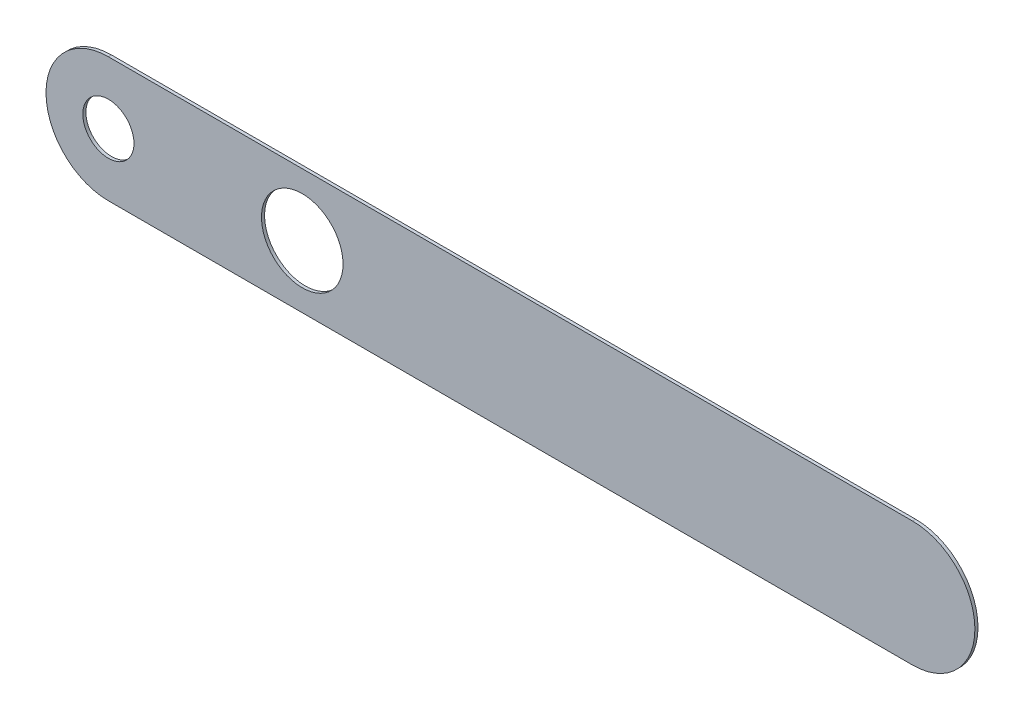
ISO-10303-21;
HEADER;
FILE_DESCRIPTION(('STEP AP214'),'2;1');
FILE_NAME('part.step','',(''),(''),'','','');
FILE_SCHEMA(('AUTOMOTIVE_DESIGN { 1 0 10303 214 1 1 1 1 }'));
ENDSEC;
DATA;
#1=APPLICATION_CONTEXT('core data for automotive mechanical design processes');
#2=APPLICATION_PROTOCOL_DEFINITION('international standard','automotive_design',2000,#1);
#3=PRODUCT_CONTEXT('',#1,'mechanical');
#4=PRODUCT('Part','Part','',(#3));
#5=PRODUCT_RELATED_PRODUCT_CATEGORY('part','',(#4));
#6=PRODUCT_DEFINITION_FORMATION('','',#4);
#7=PRODUCT_DEFINITION_CONTEXT('part definition',#1,'design');
#8=PRODUCT_DEFINITION('design','',#6,#7);
#9=PRODUCT_DEFINITION_SHAPE('','',#8);
#10=(LENGTH_UNIT() NAMED_UNIT(*) SI_UNIT(.MILLI.,.METRE.));
#11=(NAMED_UNIT(*) PLANE_ANGLE_UNIT() SI_UNIT($,.RADIAN.));
#12=(NAMED_UNIT(*) SI_UNIT($,.STERADIAN.) SOLID_ANGLE_UNIT());
#13=UNCERTAINTY_MEASURE_WITH_UNIT(LENGTH_MEASURE(1.E-05),#10,'distance_accuracy_value','');
#14=(GEOMETRIC_REPRESENTATION_CONTEXT(3) GLOBAL_UNCERTAINTY_ASSIGNED_CONTEXT((#13)) GLOBAL_UNIT_ASSIGNED_CONTEXT((#10,
#11,#12)) REPRESENTATION_CONTEXT('',''));
#15=CARTESIAN_POINT('',(0.,0.,0.));
#16=DIRECTION('',(0.,0.,1.));
#17=DIRECTION('',(1.,0.,0.));
#18=AXIS2_PLACEMENT_3D('',#15,#16,#17);
#19=CARTESIAN_POINT('',(-120.913379039705,0.,-0.7366));
#20=DIRECTION('',(0.,0.,1.));
#21=DIRECTION('',(1.,0.,0.));
#22=AXIS2_PLACEMENT_3D('',#19,#20,#21);
#23=CYLINDRICAL_SURFACE('',#22,14.7879672206833);
#24=CARTESIAN_POINT('',(-120.913379039705,0.,0.));
#25=DIRECTION('',(0.,0.,1.));
#26=DIRECTION('',(1.,0.,0.));
#27=AXIS2_PLACEMENT_3D('',#24,#25,#26);
#28=CIRCLE('',#27,14.7879672206833);
#29=CARTESIAN_POINT('',(-120.913379039705,14.7879672206833,0.));
#30=VERTEX_POINT('',#29);
#31=CARTESIAN_POINT('',(-120.913379039705,-14.7879672206833,0.));
#32=VERTEX_POINT('',#31);
#33=EDGE_CURVE('E100',#30,#32,#28,.T.);
#34=ORIENTED_EDGE('',*,*,#33,.F.);
#35=DIRECTION('',(0.,0.,1.));
#36=VECTOR('',#35,1.);
#37=CARTESIAN_POINT('',(-120.913379039705,14.7879672206833,-0.7366));
#38=LINE('',#37,#36);
#39=CARTESIAN_POINT('',(-120.913379039705,14.7879672206833,-0.7366));
#40=VERTEX_POINT('',#39);
#41=EDGE_CURVE('E11',#40,#30,#38,.T.);
#42=ORIENTED_EDGE('',*,*,#41,.F.);
#43=CARTESIAN_POINT('',(-120.913379039705,0.,-0.7366));
#44=DIRECTION('',(0.,0.,1.));
#45=DIRECTION('',(1.,0.,0.));
#46=AXIS2_PLACEMENT_3D('',#43,#44,#45);
#47=CIRCLE('',#46,14.7879672206833);
#48=CARTESIAN_POINT('',(-120.913379039705,-14.7879672206833,-0.7366));
#49=VERTEX_POINT('',#48);
#50=EDGE_CURVE('E93',#40,#49,#47,.T.);
#51=ORIENTED_EDGE('',*,*,#50,.T.);
#52=DIRECTION('',(0.,0.,1.));
#53=VECTOR('',#52,1.);
#54=CARTESIAN_POINT('',(-120.913379039705,-14.7879672206833,-0.7366));
#55=LINE('',#54,#53);
#56=EDGE_CURVE('E38',#49,#32,#55,.T.);
#57=ORIENTED_EDGE('',*,*,#56,.T.);
#58=EDGE_LOOP('',(#34,#42,#51,#57));
#59=FACE_BOUND('',#58,.T.);
#60=ADVANCED_FACE('F35',(#59),#23,.T.);
#61=CARTESIAN_POINT('',(-120.913379039705,14.7879672206833,-0.7366));
#62=DIRECTION('',(0.,1.,0.));
#63=DIRECTION('',(0.,0.,1.));
#64=AXIS2_PLACEMENT_3D('',#61,#62,#63);
#65=PLANE('',#64);
#66=DIRECTION('',(-1.,0.,0.));
#67=VECTOR('',#66,1.);
#68=CARTESIAN_POINT('',(-120.913379039705,14.7879672206833,0.));
#69=LINE('',#68,#67);
#70=CARTESIAN_POINT('',(69.7147026117926,14.7879672206833,0.));
#71=VERTEX_POINT('',#70);
#72=EDGE_CURVE('E95',#71,#30,#69,.T.);
#73=ORIENTED_EDGE('',*,*,#72,.F.);
#74=DIRECTION('',(0.,0.,1.));
#75=VECTOR('',#74,1.);
#76=CARTESIAN_POINT('',(69.7147026117926,14.7879672206833,-0.7366));
#77=LINE('',#76,#75);
#78=CARTESIAN_POINT('',(69.7147026117926,14.7879672206833,-0.7366));
#79=VERTEX_POINT('',#78);
#80=EDGE_CURVE('E44',#79,#71,#77,.T.);
#81=ORIENTED_EDGE('',*,*,#80,.F.);
#82=DIRECTION('',(-1.,0.,0.));
#83=VECTOR('',#82,1.);
#84=CARTESIAN_POINT('',(-120.913379039705,14.7879672206833,-0.7366));
#85=LINE('',#84,#83);
#86=EDGE_CURVE('E90',#79,#40,#85,.T.);
#87=ORIENTED_EDGE('',*,*,#86,.T.);
#88=ORIENTED_EDGE('',*,*,#41,.T.);
#89=EDGE_LOOP('',(#73,#81,#87,#88));
#90=FACE_BOUND('',#89,.T.);
#91=ADVANCED_FACE('F111',(#90),#65,.T.);
#92=CARTESIAN_POINT('',(69.7147026117926,0.,-0.7366));
#93=DIRECTION('',(0.,0.,1.));
#94=DIRECTION('',(1.,0.,0.));
#95=AXIS2_PLACEMENT_3D('',#92,#93,#94);
#96=CYLINDRICAL_SURFACE('',#95,14.7879672206833);
#97=CARTESIAN_POINT('',(69.7147026117926,0.,0.));
#98=DIRECTION('',(0.,0.,1.));
#99=DIRECTION('',(1.,0.,0.));
#100=AXIS2_PLACEMENT_3D('',#97,#98,#99);
#101=CIRCLE('',#100,14.7879672206833);
#102=CARTESIAN_POINT('',(69.7147026117926,-14.7879672206833,0.));
#103=VERTEX_POINT('',#102);
#104=EDGE_CURVE('E85',#103,#71,#101,.T.);
#105=ORIENTED_EDGE('',*,*,#104,.F.);
#106=DIRECTION('',(0.,0.,1.));
#107=VECTOR('',#106,1.);
#108=CARTESIAN_POINT('',(69.7147026117926,-14.7879672206833,-0.7366));
#109=LINE('',#108,#107);
#110=CARTESIAN_POINT('',(69.7147026117926,-14.7879672206833,-0.7366));
#111=VERTEX_POINT('',#110);
#112=EDGE_CURVE('E80',#111,#103,#109,.T.);
#113=ORIENTED_EDGE('',*,*,#112,.F.);
#114=CARTESIAN_POINT('',(69.7147026117926,0.,-0.7366));
#115=DIRECTION('',(0.,0.,1.));
#116=DIRECTION('',(1.,0.,0.));
#117=AXIS2_PLACEMENT_3D('',#114,#115,#116);
#118=CIRCLE('',#117,14.7879672206833);
#119=EDGE_CURVE('E83',#111,#79,#118,.T.);
#120=ORIENTED_EDGE('',*,*,#119,.T.);
#121=ORIENTED_EDGE('',*,*,#80,.T.);
#122=EDGE_LOOP('',(#105,#113,#120,#121));
#123=FACE_BOUND('',#122,.T.);
#124=ADVANCED_FACE('F82',(#123),#96,.T.);
#125=CARTESIAN_POINT('',(-120.913379039705,-14.7879672206833,-0.7366));
#126=DIRECTION('',(0.,-1.,0.));
#127=DIRECTION('',(0.,0.,-1.));
#128=AXIS2_PLACEMENT_3D('',#125,#126,#127);
#129=PLANE('',#128);
#130=DIRECTION('',(1.,0.,0.));
#131=VECTOR('',#130,1.);
#132=CARTESIAN_POINT('',(-120.913379039705,-14.7879672206833,0.));
#133=LINE('',#132,#131);
#134=EDGE_CURVE('E103',#32,#103,#133,.T.);
#135=ORIENTED_EDGE('',*,*,#134,.F.);
#136=ORIENTED_EDGE('',*,*,#56,.F.);
#137=DIRECTION('',(1.,0.,0.));
#138=VECTOR('',#137,1.);
#139=CARTESIAN_POINT('',(-120.913379039705,-14.7879672206833,-0.7366));
#140=LINE('',#139,#138);
#141=EDGE_CURVE('E89',#49,#111,#140,.T.);
#142=ORIENTED_EDGE('',*,*,#141,.T.);
#143=ORIENTED_EDGE('',*,*,#112,.T.);
#144=EDGE_LOOP('',(#135,#136,#142,#143));
#145=FACE_BOUND('',#144,.T.);
#146=ADVANCED_FACE('F92',(#145),#129,.T.);
#147=CARTESIAN_POINT('',(-120.913379039705,0.,-0.7366));
#148=DIRECTION('',(0.,0.,1.));
#149=DIRECTION('',(1.,0.,0.));
#150=AXIS2_PLACEMENT_3D('',#147,#148,#149);
#151=PLANE('',#150);
#152=CARTESIAN_POINT('',(-120.913379039705,0.,-0.7366));
#153=DIRECTION('',(0.,0.,1.));
#154=DIRECTION('',(1.,0.,0.));
#155=AXIS2_PLACEMENT_3D('',#152,#153,#154);
#156=CIRCLE('',#155,6.06374899348178);
#157=CARTESIAN_POINT('',(-114.849630046223,0.,-0.7366));
#158=VERTEX_POINT('',#157);
#159=EDGE_CURVE('E144',#158,#158,#156,.T.);
#160=ORIENTED_EDGE('',*,*,#159,.T.);
#161=EDGE_LOOP('',(#160));
#162=FACE_BOUND('',#161,.T.);
#163=CARTESIAN_POINT('',(-74.9531366656129,0.,-0.7366));
#164=DIRECTION('',(0.,0.,1.));
#165=DIRECTION('',(1.,0.,0.));
#166=AXIS2_PLACEMENT_3D('',#163,#164,#165);
#167=CIRCLE('',#166,9.66552125036934);
#168=CARTESIAN_POINT('',(-65.2876154152435,0.,-0.7366));
#169=VERTEX_POINT('',#168);
#170=EDGE_CURVE('E104',#169,#169,#167,.T.);
#171=ORIENTED_EDGE('',*,*,#170,.T.);
#172=EDGE_LOOP('',(#171));
#173=FACE_BOUND('',#172,.T.);
#174=ORIENTED_EDGE('',*,*,#50,.F.);
#175=ORIENTED_EDGE('',*,*,#86,.F.);
#176=ORIENTED_EDGE('',*,*,#119,.F.);
#177=ORIENTED_EDGE('',*,*,#141,.F.);
#178=EDGE_LOOP('',(#174,#175,#176,#177));
#179=FACE_BOUND('',#178,.T.);
#180=ADVANCED_FACE('F88',(#162,#173,#179),#151,.F.);
#181=CARTESIAN_POINT('',(-120.913379039705,0.,0.));
#182=DIRECTION('',(0.,0.,1.));
#183=DIRECTION('',(1.,0.,0.));
#184=AXIS2_PLACEMENT_3D('',#181,#182,#183);
#185=PLANE('',#184);
#186=CARTESIAN_POINT('',(-120.913379039705,0.,0.));
#187=DIRECTION('',(0.,0.,1.));
#188=DIRECTION('',(1.,0.,0.));
#189=AXIS2_PLACEMENT_3D('',#186,#187,#188);
#190=CIRCLE('',#189,6.06374899348178);
#191=CARTESIAN_POINT('',(-114.849630046223,0.,0.));
#192=VERTEX_POINT('',#191);
#193=EDGE_CURVE('E147',#192,#192,#190,.T.);
#194=ORIENTED_EDGE('',*,*,#193,.F.);
#195=EDGE_LOOP('',(#194));
#196=FACE_BOUND('',#195,.T.);
#197=CARTESIAN_POINT('',(-74.9531366656129,0.,0.));
#198=DIRECTION('',(0.,0.,1.));
#199=DIRECTION('',(1.,0.,0.));
#200=AXIS2_PLACEMENT_3D('',#197,#198,#199);
#201=CIRCLE('',#200,9.66552125036934);
#202=CARTESIAN_POINT('',(-65.2876154152435,0.,0.));
#203=VERTEX_POINT('',#202);
#204=EDGE_CURVE('E149',#203,#203,#201,.T.);
#205=ORIENTED_EDGE('',*,*,#204,.F.);
#206=EDGE_LOOP('',(#205));
#207=FACE_BOUND('',#206,.T.);
#208=ORIENTED_EDGE('',*,*,#33,.T.);
#209=ORIENTED_EDGE('',*,*,#134,.T.);
#210=ORIENTED_EDGE('',*,*,#104,.T.);
#211=ORIENTED_EDGE('',*,*,#72,.T.);
#212=EDGE_LOOP('',(#208,#209,#210,#211));
#213=FACE_BOUND('',#212,.T.);
#214=ADVANCED_FACE('F110',(#196,#207,#213),#185,.T.);
#215=CARTESIAN_POINT('',(-74.9531366656129,0.,-0.7366));
#216=DIRECTION('',(0.,0.,1.));
#217=DIRECTION('',(1.,0.,0.));
#218=AXIS2_PLACEMENT_3D('',#215,#216,#217);
#219=CYLINDRICAL_SURFACE('',#218,9.66552125036934);
#220=ORIENTED_EDGE('',*,*,#170,.F.);
#221=EDGE_LOOP('',(#220));
#222=FACE_BOUND('',#221,.T.);
#223=ORIENTED_EDGE('',*,*,#204,.T.);
#224=EDGE_LOOP('',(#223));
#225=FACE_BOUND('',#224,.T.);
#226=ADVANCED_FACE('F129',(#222,#225),#219,.F.);
#227=CARTESIAN_POINT('',(-120.913379039705,0.,-0.7366));
#228=DIRECTION('',(0.,0.,1.));
#229=DIRECTION('',(1.,0.,0.));
#230=AXIS2_PLACEMENT_3D('',#227,#228,#229);
#231=CYLINDRICAL_SURFACE('',#230,6.06374899348178);
#232=ORIENTED_EDGE('',*,*,#159,.F.);
#233=EDGE_LOOP('',(#232));
#234=FACE_BOUND('',#233,.T.);
#235=ORIENTED_EDGE('',*,*,#193,.T.);
#236=EDGE_LOOP('',(#235));
#237=FACE_BOUND('',#236,.T.);
#238=ADVANCED_FACE('F136',(#234,#237),#231,.F.);
#239=CLOSED_SHELL('',(#60,#91,#124,#146,#180,#214,#226,#238));
#240=MANIFOLD_SOLID_BREP('B2',#239);
#241=ADVANCED_BREP_SHAPE_REPRESENTATION('',(#18,#240),#14);
#242=SHAPE_DEFINITION_REPRESENTATION(#9,#241);
ENDSEC;
END-ISO-10303-21;
